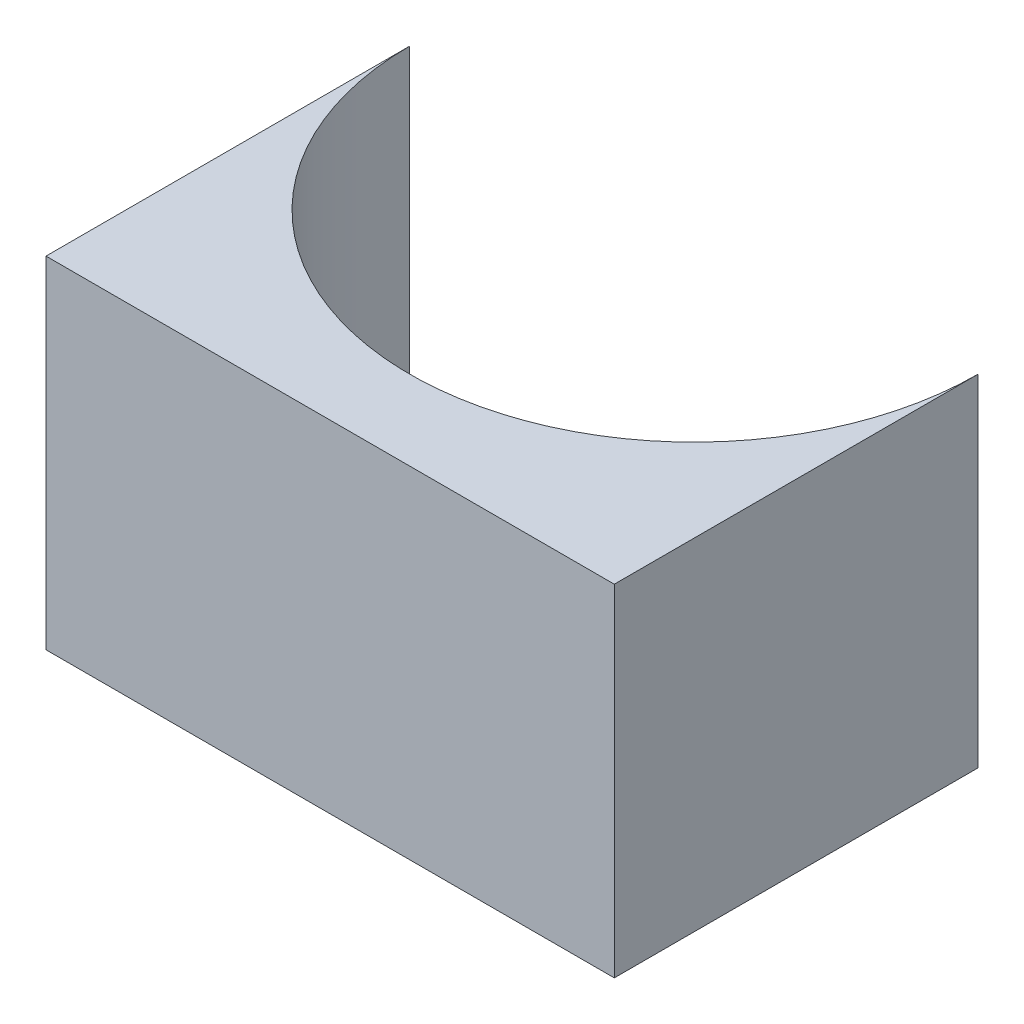
ISO-10303-21;
HEADER;
FILE_DESCRIPTION(('STEP AP214'),'2;1');
FILE_NAME('part.step','',(''),(''),'','','');
FILE_SCHEMA(('AUTOMOTIVE_DESIGN { 1 0 10303 214 1 1 1 1 }'));
ENDSEC;
DATA;
#1=APPLICATION_CONTEXT('core data for automotive mechanical design processes');
#2=APPLICATION_PROTOCOL_DEFINITION('international standard','automotive_design',2000,#1);
#3=PRODUCT_CONTEXT('',#1,'mechanical');
#4=PRODUCT('Part','Part','',(#3));
#5=PRODUCT_RELATED_PRODUCT_CATEGORY('part','',(#4));
#6=PRODUCT_DEFINITION_FORMATION('','',#4);
#7=PRODUCT_DEFINITION_CONTEXT('part definition',#1,'design');
#8=PRODUCT_DEFINITION('design','',#6,#7);
#9=PRODUCT_DEFINITION_SHAPE('','',#8);
#10=(LENGTH_UNIT() NAMED_UNIT(*) SI_UNIT(.MILLI.,.METRE.));
#11=(NAMED_UNIT(*) PLANE_ANGLE_UNIT() SI_UNIT($,.RADIAN.));
#12=(NAMED_UNIT(*) SI_UNIT($,.STERADIAN.) SOLID_ANGLE_UNIT());
#13=UNCERTAINTY_MEASURE_WITH_UNIT(LENGTH_MEASURE(1.E-05),#10,'distance_accuracy_value','');
#14=(GEOMETRIC_REPRESENTATION_CONTEXT(3) GLOBAL_UNCERTAINTY_ASSIGNED_CONTEXT((#13)) GLOBAL_UNIT_ASSIGNED_CONTEXT((#10,
#11,#12)) REPRESENTATION_CONTEXT('',''));
#15=CARTESIAN_POINT('',(0.,0.,0.));
#16=DIRECTION('',(0.,0.,1.));
#17=DIRECTION('',(1.,0.,0.));
#18=AXIS2_PLACEMENT_3D('',#15,#16,#17);
#19=CARTESIAN_POINT('',(-12.5,30.,-16.));
#20=DIRECTION('',(0.,-1.,0.));
#21=DIRECTION('',(0.,0.,-1.));
#22=AXIS2_PLACEMENT_3D('',#19,#20,#21);
#23=CYLINDRICAL_SURFACE('',#22,25.);
#24=CARTESIAN_POINT('',(-12.5,0.,-16.));
#25=DIRECTION('',(0.,-1.,0.));
#26=DIRECTION('',(0.,0.,1.));
#27=AXIS2_PLACEMENT_3D('',#24,#25,#26);
#28=CIRCLE('',#27,25.);
#29=CARTESIAN_POINT('',(12.5,0.,-16.));
#30=VERTEX_POINT('',#29);
#31=CARTESIAN_POINT('',(-37.5,0.,-16.));
#32=VERTEX_POINT('',#31);
#33=EDGE_CURVE('E102',#30,#32,#28,.T.);
#34=ORIENTED_EDGE('',*,*,#33,.T.);
#35=DIRECTION('',(0.,-1.,0.));
#36=VECTOR('',#35,1.);
#37=CARTESIAN_POINT('',(-37.5,30.,-16.));
#38=LINE('',#37,#36);
#39=CARTESIAN_POINT('',(-37.5,30.,-16.));
#40=VERTEX_POINT('',#39);
#41=EDGE_CURVE('E11',#40,#32,#38,.T.);
#42=ORIENTED_EDGE('',*,*,#41,.F.);
#43=CARTESIAN_POINT('',(-12.5,30.,-16.));
#44=DIRECTION('',(0.,-1.,0.));
#45=DIRECTION('',(0.,0.,1.));
#46=AXIS2_PLACEMENT_3D('',#43,#44,#45);
#47=CIRCLE('',#46,25.);
#48=CARTESIAN_POINT('',(12.5,30.,-16.));
#49=VERTEX_POINT('',#48);
#50=EDGE_CURVE('E90',#49,#40,#47,.T.);
#51=ORIENTED_EDGE('',*,*,#50,.F.);
#52=DIRECTION('',(0.,-1.,0.));
#53=VECTOR('',#52,1.);
#54=CARTESIAN_POINT('',(12.5,30.,-16.));
#55=LINE('',#54,#53);
#56=EDGE_CURVE('E98',#49,#30,#55,.T.);
#57=ORIENTED_EDGE('',*,*,#56,.T.);
#58=EDGE_LOOP('',(#34,#42,#51,#57));
#59=FACE_BOUND('',#58,.T.);
#60=ADVANCED_FACE('F39',(#59),#23,.F.);
#61=CARTESIAN_POINT('',(-37.5,30.,16.));
#62=DIRECTION('',(1.,0.,0.));
#63=DIRECTION('',(0.,0.,-1.));
#64=AXIS2_PLACEMENT_3D('',#61,#62,#63);
#65=PLANE('',#64);
#66=DIRECTION('',(0.,0.,1.));
#67=VECTOR('',#66,1.);
#68=CARTESIAN_POINT('',(-37.5,0.,16.));
#69=LINE('',#68,#67);
#70=CARTESIAN_POINT('',(-37.5,0.,16.));
#71=VERTEX_POINT('',#70);
#72=EDGE_CURVE('E94',#32,#71,#69,.T.);
#73=ORIENTED_EDGE('',*,*,#72,.T.);
#74=DIRECTION('',(0.,-1.,0.));
#75=VECTOR('',#74,1.);
#76=CARTESIAN_POINT('',(-37.5,30.,16.));
#77=LINE('',#76,#75);
#78=CARTESIAN_POINT('',(-37.5,30.,16.));
#79=VERTEX_POINT('',#78);
#80=EDGE_CURVE('E47',#79,#71,#77,.T.);
#81=ORIENTED_EDGE('',*,*,#80,.F.);
#82=DIRECTION('',(0.,0.,1.));
#83=VECTOR('',#82,1.);
#84=CARTESIAN_POINT('',(-37.5,30.,16.));
#85=LINE('',#84,#83);
#86=EDGE_CURVE('E85',#40,#79,#85,.T.);
#87=ORIENTED_EDGE('',*,*,#86,.F.);
#88=ORIENTED_EDGE('',*,*,#41,.T.);
#89=EDGE_LOOP('',(#73,#81,#87,#88));
#90=FACE_BOUND('',#89,.T.);
#91=ADVANCED_FACE('F93',(#90),#65,.F.);
#92=CARTESIAN_POINT('',(-37.5,30.,16.));
#93=DIRECTION('',(0.,0.,-1.));
#94=DIRECTION('',(-1.,0.,0.));
#95=AXIS2_PLACEMENT_3D('',#92,#93,#94);
#96=PLANE('',#95);
#97=DIRECTION('',(1.,0.,0.));
#98=VECTOR('',#97,1.);
#99=CARTESIAN_POINT('',(-37.5,0.,16.));
#100=LINE('',#99,#98);
#101=CARTESIAN_POINT('',(12.5,0.,16.));
#102=VERTEX_POINT('',#101);
#103=EDGE_CURVE('E72',#71,#102,#100,.T.);
#104=ORIENTED_EDGE('',*,*,#103,.T.);
#105=DIRECTION('',(0.,-1.,0.));
#106=VECTOR('',#105,1.);
#107=CARTESIAN_POINT('',(12.5,30.,16.));
#108=LINE('',#107,#106);
#109=CARTESIAN_POINT('',(12.5,30.,16.));
#110=VERTEX_POINT('',#109);
#111=EDGE_CURVE('E95',#110,#102,#108,.T.);
#112=ORIENTED_EDGE('',*,*,#111,.F.);
#113=DIRECTION('',(1.,0.,0.));
#114=VECTOR('',#113,1.);
#115=CARTESIAN_POINT('',(-37.5,30.,16.));
#116=LINE('',#115,#114);
#117=EDGE_CURVE('E88',#79,#110,#116,.T.);
#118=ORIENTED_EDGE('',*,*,#117,.F.);
#119=ORIENTED_EDGE('',*,*,#80,.T.);
#120=EDGE_LOOP('',(#104,#112,#118,#119));
#121=FACE_BOUND('',#120,.T.);
#122=ADVANCED_FACE('F96',(#121),#96,.F.);
#123=CARTESIAN_POINT('',(12.5,30.,16.));
#124=DIRECTION('',(-1.,0.,0.));
#125=DIRECTION('',(0.,0.,1.));
#126=AXIS2_PLACEMENT_3D('',#123,#124,#125);
#127=PLANE('',#126);
#128=DIRECTION('',(0.,0.,-1.));
#129=VECTOR('',#128,1.);
#130=CARTESIAN_POINT('',(12.5,0.,16.));
#131=LINE('',#130,#129);
#132=EDGE_CURVE('E78',#102,#30,#131,.T.);
#133=ORIENTED_EDGE('',*,*,#132,.T.);
#134=ORIENTED_EDGE('',*,*,#56,.F.);
#135=DIRECTION('',(0.,0.,-1.));
#136=VECTOR('',#135,1.);
#137=CARTESIAN_POINT('',(12.5,30.,16.));
#138=LINE('',#137,#136);
#139=EDGE_CURVE('E55',#110,#49,#138,.T.);
#140=ORIENTED_EDGE('',*,*,#139,.F.);
#141=ORIENTED_EDGE('',*,*,#111,.T.);
#142=EDGE_LOOP('',(#133,#134,#140,#141));
#143=FACE_BOUND('',#142,.T.);
#144=ADVANCED_FACE('F109',(#143),#127,.F.);
#145=CARTESIAN_POINT('',(-12.5,30.,-16.));
#146=DIRECTION('',(0.,1.,0.));
#147=DIRECTION('',(0.,0.,1.));
#148=AXIS2_PLACEMENT_3D('',#145,#146,#147);
#149=PLANE('',#148);
#150=ORIENTED_EDGE('',*,*,#50,.T.);
#151=ORIENTED_EDGE('',*,*,#86,.T.);
#152=ORIENTED_EDGE('',*,*,#117,.T.);
#153=ORIENTED_EDGE('',*,*,#139,.T.);
#154=EDGE_LOOP('',(#150,#151,#152,#153));
#155=FACE_BOUND('',#154,.T.);
#156=ADVANCED_FACE('F86',(#155),#149,.T.);
#157=CARTESIAN_POINT('',(-12.5,0.,-16.));
#158=DIRECTION('',(0.,1.,0.));
#159=DIRECTION('',(0.,0.,1.));
#160=AXIS2_PLACEMENT_3D('',#157,#158,#159);
#161=PLANE('',#160);
#162=ORIENTED_EDGE('',*,*,#33,.F.);
#163=ORIENTED_EDGE('',*,*,#132,.F.);
#164=ORIENTED_EDGE('',*,*,#103,.F.);
#165=ORIENTED_EDGE('',*,*,#72,.F.);
#166=EDGE_LOOP('',(#162,#163,#164,#165));
#167=FACE_BOUND('',#166,.T.);
#168=ADVANCED_FACE('F112',(#167),#161,.F.);
#169=CLOSED_SHELL('',(#60,#91,#122,#144,#156,#168));
#170=MANIFOLD_SOLID_BREP('B2',#169);
#171=ADVANCED_BREP_SHAPE_REPRESENTATION('',(#18,#170),#14);
#172=SHAPE_DEFINITION_REPRESENTATION(#9,#171);
ENDSEC;
END-ISO-10303-21;
